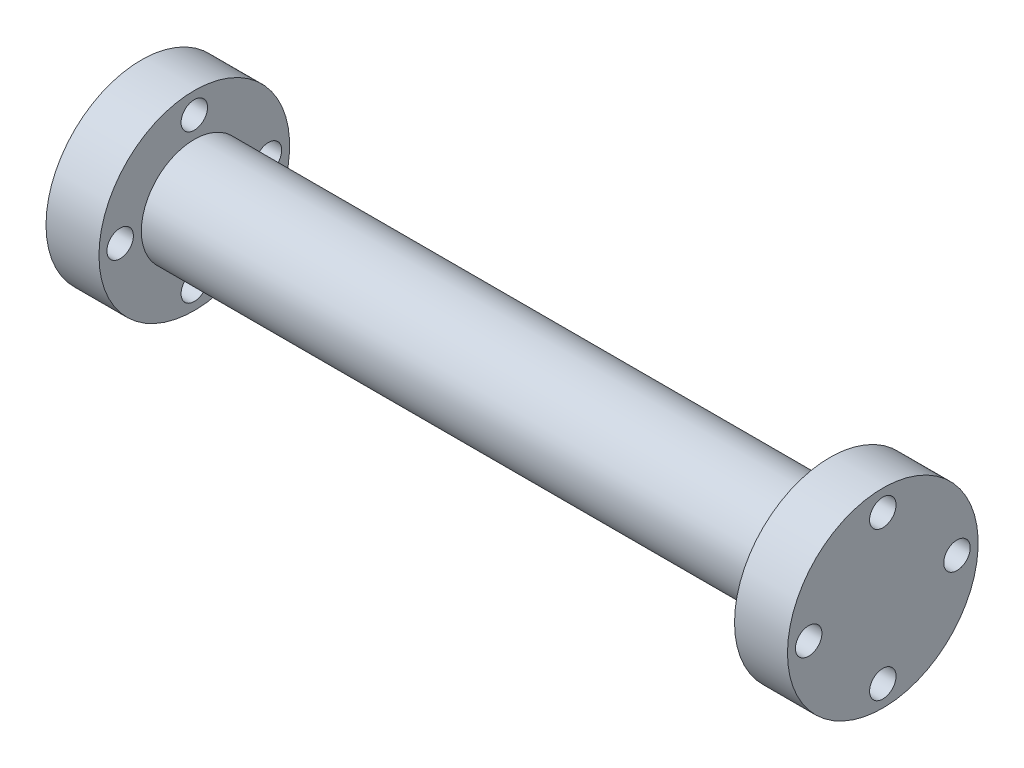
ISO-10303-21;
HEADER;
FILE_DESCRIPTION(('STEP AP214'),'2;1');
FILE_NAME('part.step','',(''),(''),'','','');
FILE_SCHEMA(('AUTOMOTIVE_DESIGN { 1 0 10303 214 1 1 1 1 }'));
ENDSEC;
DATA;
#1=APPLICATION_CONTEXT('core data for automotive mechanical design processes');
#2=APPLICATION_PROTOCOL_DEFINITION('international standard','automotive_design',2000,#1);
#3=PRODUCT_CONTEXT('',#1,'mechanical');
#4=PRODUCT('Part','Part','',(#3));
#5=PRODUCT_RELATED_PRODUCT_CATEGORY('part','',(#4));
#6=PRODUCT_DEFINITION_FORMATION('','',#4);
#7=PRODUCT_DEFINITION_CONTEXT('part definition',#1,'design');
#8=PRODUCT_DEFINITION('design','',#6,#7);
#9=PRODUCT_DEFINITION_SHAPE('','',#8);
#10=(LENGTH_UNIT() NAMED_UNIT(*) SI_UNIT(.MILLI.,.METRE.));
#11=(NAMED_UNIT(*) PLANE_ANGLE_UNIT() SI_UNIT($,.RADIAN.));
#12=(NAMED_UNIT(*) SI_UNIT($,.STERADIAN.) SOLID_ANGLE_UNIT());
#13=UNCERTAINTY_MEASURE_WITH_UNIT(LENGTH_MEASURE(1.E-05),#10,'distance_accuracy_value','');
#14=(GEOMETRIC_REPRESENTATION_CONTEXT(3) GLOBAL_UNCERTAINTY_ASSIGNED_CONTEXT((#13)) GLOBAL_UNIT_ASSIGNED_CONTEXT((#10,
#11,#12)) REPRESENTATION_CONTEXT('',''));
#15=CARTESIAN_POINT('',(0.,0.,0.));
#16=DIRECTION('',(0.,0.,1.));
#17=DIRECTION('',(1.,0.,0.));
#18=AXIS2_PLACEMENT_3D('',#15,#16,#17);
#19=CARTESIAN_POINT('',(-43.9050676278634,9.,0.));
#20=DIRECTION('',(1.,0.,0.));
#21=DIRECTION('',(0.,0.,-1.));
#22=AXIS2_PLACEMENT_3D('',#19,#20,#21);
#23=PLANE('',#22);
#24=CARTESIAN_POINT('',(-43.9050676278634,7.,0.));
#25=DIRECTION('',(-1.,0.,0.));
#26=DIRECTION('',(0.,0.,1.));
#27=AXIS2_PLACEMENT_3D('',#24,#25,#26);
#28=CIRCLE('',#27,1.24999999999999);
#29=CARTESIAN_POINT('',(-43.9050676278634,7.,1.24999999999999));
#30=VERTEX_POINT('',#29);
#31=EDGE_CURVE('E79',#30,#30,#28,.T.);
#32=ORIENTED_EDGE('',*,*,#31,.F.);
#33=EDGE_LOOP('',(#32));
#34=FACE_BOUND('',#33,.T.);
#35=CARTESIAN_POINT('',(-43.9050676278634,0.,-7.));
#36=DIRECTION('',(-1.,0.,0.));
#37=DIRECTION('',(0.,0.,1.));
#38=AXIS2_PLACEMENT_3D('',#35,#36,#37);
#39=CIRCLE('',#38,1.24999999999999);
#40=CARTESIAN_POINT('',(-43.9050676278634,0.,-5.75000000000001));
#41=VERTEX_POINT('',#40);
#42=EDGE_CURVE('E73',#41,#41,#39,.T.);
#43=ORIENTED_EDGE('',*,*,#42,.F.);
#44=EDGE_LOOP('',(#43));
#45=FACE_BOUND('',#44,.T.);
#46=CARTESIAN_POINT('',(-43.9050676278634,-7.,0.));
#47=DIRECTION('',(-1.,0.,0.));
#48=DIRECTION('',(0.,0.,1.));
#49=AXIS2_PLACEMENT_3D('',#46,#47,#48);
#50=CIRCLE('',#49,1.24999999999999);
#51=CARTESIAN_POINT('',(-43.9050676278634,-7.,1.24999999999999));
#52=VERTEX_POINT('',#51);
#53=EDGE_CURVE('E67',#52,#52,#50,.T.);
#54=ORIENTED_EDGE('',*,*,#53,.F.);
#55=EDGE_LOOP('',(#54));
#56=FACE_BOUND('',#55,.T.);
#57=CARTESIAN_POINT('',(-43.9050676278634,0.,0.));
#58=DIRECTION('',(-1.,0.,0.));
#59=DIRECTION('',(0.,0.,1.));
#60=AXIS2_PLACEMENT_3D('',#57,#58,#59);
#61=CIRCLE('',#60,9.);
#62=CARTESIAN_POINT('',(-43.9050676278634,0.,9.));
#63=VERTEX_POINT('',#62);
#64=EDGE_CURVE('E10',#63,#63,#61,.T.);
#65=ORIENTED_EDGE('',*,*,#64,.T.);
#66=EDGE_LOOP('',(#65));
#67=FACE_BOUND('',#66,.T.);
#68=CARTESIAN_POINT('',(-43.9050676278634,0.,7.));
#69=DIRECTION('',(-1.,0.,0.));
#70=DIRECTION('',(0.,0.,1.));
#71=AXIS2_PLACEMENT_3D('',#68,#69,#70);
#72=CIRCLE('',#71,1.24999999999999);
#73=CARTESIAN_POINT('',(-43.9050676278634,0.,8.24999999999999));
#74=VERTEX_POINT('',#73);
#75=EDGE_CURVE('E85',#74,#74,#72,.T.);
#76=ORIENTED_EDGE('',*,*,#75,.F.);
#77=EDGE_LOOP('',(#76));
#78=FACE_BOUND('',#77,.T.);
#79=ADVANCED_FACE('F38',(#34,#45,#56,#67,#78),#23,.F.);
#80=CARTESIAN_POINT('',(-43.9050676278634,0.,0.));
#81=DIRECTION('',(-1.,0.,0.));
#82=DIRECTION('',(0.,0.,1.));
#83=AXIS2_PLACEMENT_3D('',#80,#81,#82);
#84=CYLINDRICAL_SURFACE('',#83,9.);
#85=ORIENTED_EDGE('',*,*,#64,.F.);
#86=EDGE_LOOP('',(#85));
#87=FACE_BOUND('',#86,.T.);
#88=CARTESIAN_POINT('',(-38.9050676278634,0.,0.));
#89=DIRECTION('',(-1.,0.,0.));
#90=DIRECTION('',(0.,0.,1.));
#91=AXIS2_PLACEMENT_3D('',#88,#89,#90);
#92=CIRCLE('',#91,9.);
#93=CARTESIAN_POINT('',(-38.9050676278634,0.,9.));
#94=VERTEX_POINT('',#93);
#95=EDGE_CURVE('E61',#94,#94,#92,.T.);
#96=ORIENTED_EDGE('',*,*,#95,.T.);
#97=EDGE_LOOP('',(#96));
#98=FACE_BOUND('',#97,.T.);
#99=ADVANCED_FACE('F40',(#87,#98),#84,.T.);
#100=CARTESIAN_POINT('',(26.0949323721366,0.,0.));
#101=DIRECTION('',(-1.,0.,0.));
#102=DIRECTION('',(0.,0.,1.));
#103=AXIS2_PLACEMENT_3D('',#100,#101,#102);
#104=PLANE('',#103);
#105=CARTESIAN_POINT('',(26.0949323721366,-7.,0.));
#106=DIRECTION('',(1.,0.,0.));
#107=DIRECTION('',(0.,0.,-1.));
#108=AXIS2_PLACEMENT_3D('',#105,#106,#107);
#109=CIRCLE('',#108,1.24999999999999);
#110=CARTESIAN_POINT('',(26.0949323721366,-7.,-1.24999999999999));
#111=VERTEX_POINT('',#110);
#112=EDGE_CURVE('E109',#111,#111,#109,.T.);
#113=ORIENTED_EDGE('',*,*,#112,.F.);
#114=EDGE_LOOP('',(#113));
#115=FACE_BOUND('',#114,.T.);
#116=CARTESIAN_POINT('',(26.0949323721366,0.,-7.));
#117=DIRECTION('',(1.,0.,0.));
#118=DIRECTION('',(0.,0.,-1.));
#119=AXIS2_PLACEMENT_3D('',#116,#117,#118);
#120=CIRCLE('',#119,1.24999999999999);
#121=CARTESIAN_POINT('',(26.0949323721366,0.,-8.24999999999999));
#122=VERTEX_POINT('',#121);
#123=EDGE_CURVE('E103',#122,#122,#120,.T.);
#124=ORIENTED_EDGE('',*,*,#123,.F.);
#125=EDGE_LOOP('',(#124));
#126=FACE_BOUND('',#125,.T.);
#127=CARTESIAN_POINT('',(26.0949323721366,7.,0.));
#128=DIRECTION('',(1.,0.,0.));
#129=DIRECTION('',(0.,0.,-1.));
#130=AXIS2_PLACEMENT_3D('',#127,#128,#129);
#131=CIRCLE('',#130,1.24999999999999);
#132=CARTESIAN_POINT('',(26.0949323721366,7.,-1.24999999999999));
#133=VERTEX_POINT('',#132);
#134=EDGE_CURVE('E97',#133,#133,#131,.T.);
#135=ORIENTED_EDGE('',*,*,#134,.F.);
#136=EDGE_LOOP('',(#135));
#137=FACE_BOUND('',#136,.T.);
#138=CARTESIAN_POINT('',(26.0949323721366,0.,7.));
#139=DIRECTION('',(1.,0.,0.));
#140=DIRECTION('',(0.,0.,-1.));
#141=AXIS2_PLACEMENT_3D('',#138,#139,#140);
#142=CIRCLE('',#141,1.24999999999999);
#143=CARTESIAN_POINT('',(26.0949323721366,0.,5.75000000000001));
#144=VERTEX_POINT('',#143);
#145=EDGE_CURVE('E91',#144,#144,#142,.T.);
#146=ORIENTED_EDGE('',*,*,#145,.F.);
#147=EDGE_LOOP('',(#146));
#148=FACE_BOUND('',#147,.T.);
#149=CARTESIAN_POINT('',(26.0949323721366,0.,0.));
#150=DIRECTION('',(-1.,0.,0.));
#151=DIRECTION('',(0.,0.,1.));
#152=AXIS2_PLACEMENT_3D('',#149,#150,#151);
#153=CIRCLE('',#152,9.00000000000001);
#154=CARTESIAN_POINT('',(26.0949323721366,0.,9.00000000000001));
#155=VERTEX_POINT('',#154);
#156=EDGE_CURVE('E45',#155,#155,#153,.T.);
#157=ORIENTED_EDGE('',*,*,#156,.F.);
#158=EDGE_LOOP('',(#157));
#159=FACE_BOUND('',#158,.T.);
#160=ADVANCED_FACE('F115',(#115,#126,#137,#148,#159),#104,.F.);
#161=CARTESIAN_POINT('',(-43.9050676278634,0.,0.));
#162=DIRECTION('',(-1.,0.,0.));
#163=DIRECTION('',(0.,0.,1.));
#164=AXIS2_PLACEMENT_3D('',#161,#162,#163);
#165=CYLINDRICAL_SURFACE('',#164,9.00000000000001);
#166=CARTESIAN_POINT('',(21.0949323721366,0.,0.));
#167=DIRECTION('',(-1.,0.,0.));
#168=DIRECTION('',(0.,0.,1.));
#169=AXIS2_PLACEMENT_3D('',#166,#167,#168);
#170=CIRCLE('',#169,9.00000000000001);
#171=CARTESIAN_POINT('',(21.0949323721366,0.,9.00000000000001));
#172=VERTEX_POINT('',#171);
#173=EDGE_CURVE('E49',#172,#172,#170,.T.);
#174=ORIENTED_EDGE('',*,*,#173,.F.);
#175=EDGE_LOOP('',(#174));
#176=FACE_BOUND('',#175,.T.);
#177=ORIENTED_EDGE('',*,*,#156,.T.);
#178=EDGE_LOOP('',(#177));
#179=FACE_BOUND('',#178,.T.);
#180=ADVANCED_FACE('F118',(#176,#179),#165,.T.);
#181=CARTESIAN_POINT('',(21.0949323721366,9.00000000000001,0.));
#182=DIRECTION('',(1.,0.,0.));
#183=DIRECTION('',(0.,0.,-1.));
#184=AXIS2_PLACEMENT_3D('',#181,#182,#183);
#185=PLANE('',#184);
#186=CARTESIAN_POINT('',(21.0949323721366,-7.,0.));
#187=DIRECTION('',(1.,0.,0.));
#188=DIRECTION('',(0.,0.,-1.));
#189=AXIS2_PLACEMENT_3D('',#186,#187,#188);
#190=CIRCLE('',#189,1.25);
#191=CARTESIAN_POINT('',(21.0949323721366,-7.,-1.25));
#192=VERTEX_POINT('',#191);
#193=EDGE_CURVE('E106',#192,#192,#190,.T.);
#194=ORIENTED_EDGE('',*,*,#193,.T.);
#195=EDGE_LOOP('',(#194));
#196=FACE_BOUND('',#195,.T.);
#197=CARTESIAN_POINT('',(21.0949323721366,0.,-7.));
#198=DIRECTION('',(1.,0.,0.));
#199=DIRECTION('',(0.,0.,-1.));
#200=AXIS2_PLACEMENT_3D('',#197,#198,#199);
#201=CIRCLE('',#200,1.25);
#202=CARTESIAN_POINT('',(21.0949323721366,0.,-8.25));
#203=VERTEX_POINT('',#202);
#204=EDGE_CURVE('E100',#203,#203,#201,.T.);
#205=ORIENTED_EDGE('',*,*,#204,.T.);
#206=EDGE_LOOP('',(#205));
#207=FACE_BOUND('',#206,.T.);
#208=CARTESIAN_POINT('',(21.0949323721366,7.,0.));
#209=DIRECTION('',(1.,0.,0.));
#210=DIRECTION('',(0.,0.,-1.));
#211=AXIS2_PLACEMENT_3D('',#208,#209,#210);
#212=CIRCLE('',#211,1.25);
#213=CARTESIAN_POINT('',(21.0949323721366,7.,-1.25));
#214=VERTEX_POINT('',#213);
#215=EDGE_CURVE('E94',#214,#214,#212,.T.);
#216=ORIENTED_EDGE('',*,*,#215,.T.);
#217=EDGE_LOOP('',(#216));
#218=FACE_BOUND('',#217,.T.);
#219=CARTESIAN_POINT('',(21.0949323721366,0.,7.));
#220=DIRECTION('',(1.,0.,0.));
#221=DIRECTION('',(0.,0.,-1.));
#222=AXIS2_PLACEMENT_3D('',#219,#220,#221);
#223=CIRCLE('',#222,1.25);
#224=CARTESIAN_POINT('',(21.0949323721366,0.,5.75));
#225=VERTEX_POINT('',#224);
#226=EDGE_CURVE('E88',#225,#225,#223,.T.);
#227=ORIENTED_EDGE('',*,*,#226,.T.);
#228=EDGE_LOOP('',(#227));
#229=FACE_BOUND('',#228,.T.);
#230=CARTESIAN_POINT('',(21.0949323721366,0.,0.));
#231=DIRECTION('',(-1.,0.,0.));
#232=DIRECTION('',(0.,0.,1.));
#233=AXIS2_PLACEMENT_3D('',#230,#231,#232);
#234=CIRCLE('',#233,5.);
#235=CARTESIAN_POINT('',(21.0949323721366,0.,5.));
#236=VERTEX_POINT('',#235);
#237=EDGE_CURVE('E53',#236,#236,#234,.T.);
#238=ORIENTED_EDGE('',*,*,#237,.F.);
#239=EDGE_LOOP('',(#238));
#240=FACE_BOUND('',#239,.T.);
#241=ORIENTED_EDGE('',*,*,#173,.T.);
#242=EDGE_LOOP('',(#241));
#243=FACE_BOUND('',#242,.T.);
#244=ADVANCED_FACE('F155',(#196,#207,#218,#229,#240,#243),#185,.F.);
#245=CARTESIAN_POINT('',(-43.9050676278634,0.,0.));
#246=DIRECTION('',(-1.,0.,0.));
#247=DIRECTION('',(0.,0.,1.));
#248=AXIS2_PLACEMENT_3D('',#245,#246,#247);
#249=CYLINDRICAL_SURFACE('',#248,5.);
#250=CARTESIAN_POINT('',(-38.9050676278634,0.,0.));
#251=DIRECTION('',(-1.,0.,0.));
#252=DIRECTION('',(0.,0.,1.));
#253=AXIS2_PLACEMENT_3D('',#250,#251,#252);
#254=CIRCLE('',#253,5.);
#255=CARTESIAN_POINT('',(-38.9050676278634,0.,5.));
#256=VERTEX_POINT('',#255);
#257=EDGE_CURVE('E58',#256,#256,#254,.T.);
#258=ORIENTED_EDGE('',*,*,#257,.F.);
#259=EDGE_LOOP('',(#258));
#260=FACE_BOUND('',#259,.T.);
#261=ORIENTED_EDGE('',*,*,#237,.T.);
#262=EDGE_LOOP('',(#261));
#263=FACE_BOUND('',#262,.T.);
#264=ADVANCED_FACE('F159',(#260,#263),#249,.T.);
#265=CARTESIAN_POINT('',(-38.9050676278634,5.,0.));
#266=DIRECTION('',(-1.,0.,0.));
#267=DIRECTION('',(0.,0.,1.));
#268=AXIS2_PLACEMENT_3D('',#265,#266,#267);
#269=PLANE('',#268);
#270=CARTESIAN_POINT('',(-38.9050676278634,0.,7.));
#271=DIRECTION('',(-1.,0.,0.));
#272=DIRECTION('',(0.,0.,1.));
#273=AXIS2_PLACEMENT_3D('',#270,#271,#272);
#274=CIRCLE('',#273,1.25);
#275=CARTESIAN_POINT('',(-38.9050676278634,0.,8.25));
#276=VERTEX_POINT('',#275);
#277=EDGE_CURVE('E82',#276,#276,#274,.T.);
#278=ORIENTED_EDGE('',*,*,#277,.T.);
#279=EDGE_LOOP('',(#278));
#280=FACE_BOUND('',#279,.T.);
#281=CARTESIAN_POINT('',(-38.9050676278634,7.,0.));
#282=DIRECTION('',(-1.,0.,0.));
#283=DIRECTION('',(0.,0.,1.));
#284=AXIS2_PLACEMENT_3D('',#281,#282,#283);
#285=CIRCLE('',#284,1.25);
#286=CARTESIAN_POINT('',(-38.9050676278634,7.,1.25));
#287=VERTEX_POINT('',#286);
#288=EDGE_CURVE('E76',#287,#287,#285,.T.);
#289=ORIENTED_EDGE('',*,*,#288,.T.);
#290=EDGE_LOOP('',(#289));
#291=FACE_BOUND('',#290,.T.);
#292=CARTESIAN_POINT('',(-38.9050676278634,0.,-7.));
#293=DIRECTION('',(-1.,0.,0.));
#294=DIRECTION('',(0.,0.,1.));
#295=AXIS2_PLACEMENT_3D('',#292,#293,#294);
#296=CIRCLE('',#295,1.25);
#297=CARTESIAN_POINT('',(-38.9050676278634,0.,-5.75));
#298=VERTEX_POINT('',#297);
#299=EDGE_CURVE('E70',#298,#298,#296,.T.);
#300=ORIENTED_EDGE('',*,*,#299,.T.);
#301=EDGE_LOOP('',(#300));
#302=FACE_BOUND('',#301,.T.);
#303=CARTESIAN_POINT('',(-38.9050676278634,-7.,0.));
#304=DIRECTION('',(-1.,0.,0.));
#305=DIRECTION('',(0.,0.,1.));
#306=AXIS2_PLACEMENT_3D('',#303,#304,#305);
#307=CIRCLE('',#306,1.25);
#308=CARTESIAN_POINT('',(-38.9050676278634,-7.,1.25));
#309=VERTEX_POINT('',#308);
#310=EDGE_CURVE('E64',#309,#309,#307,.T.);
#311=ORIENTED_EDGE('',*,*,#310,.T.);
#312=EDGE_LOOP('',(#311));
#313=FACE_BOUND('',#312,.T.);
#314=ORIENTED_EDGE('',*,*,#95,.F.);
#315=EDGE_LOOP('',(#314));
#316=FACE_BOUND('',#315,.T.);
#317=ORIENTED_EDGE('',*,*,#257,.T.);
#318=EDGE_LOOP('',(#317));
#319=FACE_BOUND('',#318,.T.);
#320=ADVANCED_FACE('F163',(#280,#291,#302,#313,#316,#319),#269,.F.);
#321=CARTESIAN_POINT('',(-43.9050676278634,-7.,0.));
#322=DIRECTION('',(-1.,0.,0.));
#323=DIRECTION('',(0.,0.,1.));
#324=AXIS2_PLACEMENT_3D('',#321,#322,#323);
#325=CYLINDRICAL_SURFACE('',#324,1.24999999999999);
#326=ORIENTED_EDGE('',*,*,#310,.F.);
#327=EDGE_LOOP('',(#326));
#328=FACE_BOUND('',#327,.T.);
#329=ORIENTED_EDGE('',*,*,#53,.T.);
#330=EDGE_LOOP('',(#329));
#331=FACE_BOUND('',#330,.T.);
#332=ADVANCED_FACE('F167',(#328,#331),#325,.F.);
#333=CARTESIAN_POINT('',(-43.9050676278634,0.,-7.));
#334=DIRECTION('',(-1.,0.,0.));
#335=DIRECTION('',(0.,0.,1.));
#336=AXIS2_PLACEMENT_3D('',#333,#334,#335);
#337=CYLINDRICAL_SURFACE('',#336,1.24999999999999);
#338=ORIENTED_EDGE('',*,*,#299,.F.);
#339=EDGE_LOOP('',(#338));
#340=FACE_BOUND('',#339,.T.);
#341=ORIENTED_EDGE('',*,*,#42,.T.);
#342=EDGE_LOOP('',(#341));
#343=FACE_BOUND('',#342,.T.);
#344=ADVANCED_FACE('F171',(#340,#343),#337,.F.);
#345=CARTESIAN_POINT('',(-43.9050676278634,7.,0.));
#346=DIRECTION('',(-1.,0.,0.));
#347=DIRECTION('',(0.,0.,1.));
#348=AXIS2_PLACEMENT_3D('',#345,#346,#347);
#349=CYLINDRICAL_SURFACE('',#348,1.24999999999999);
#350=ORIENTED_EDGE('',*,*,#288,.F.);
#351=EDGE_LOOP('',(#350));
#352=FACE_BOUND('',#351,.T.);
#353=ORIENTED_EDGE('',*,*,#31,.T.);
#354=EDGE_LOOP('',(#353));
#355=FACE_BOUND('',#354,.T.);
#356=ADVANCED_FACE('F140',(#352,#355),#349,.F.);
#357=CARTESIAN_POINT('',(-43.9050676278634,0.,7.));
#358=DIRECTION('',(-1.,0.,0.));
#359=DIRECTION('',(0.,0.,1.));
#360=AXIS2_PLACEMENT_3D('',#357,#358,#359);
#361=CYLINDRICAL_SURFACE('',#360,1.24999999999999);
#362=ORIENTED_EDGE('',*,*,#277,.F.);
#363=EDGE_LOOP('',(#362));
#364=FACE_BOUND('',#363,.T.);
#365=ORIENTED_EDGE('',*,*,#75,.T.);
#366=EDGE_LOOP('',(#365));
#367=FACE_BOUND('',#366,.T.);
#368=ADVANCED_FACE('F130',(#364,#367),#361,.F.);
#369=CARTESIAN_POINT('',(26.0949323721366,0.,7.));
#370=DIRECTION('',(1.,0.,0.));
#371=DIRECTION('',(0.,0.,-1.));
#372=AXIS2_PLACEMENT_3D('',#369,#370,#371);
#373=CYLINDRICAL_SURFACE('',#372,1.24999999999999);
#374=ORIENTED_EDGE('',*,*,#226,.F.);
#375=EDGE_LOOP('',(#374));
#376=FACE_BOUND('',#375,.T.);
#377=ORIENTED_EDGE('',*,*,#145,.T.);
#378=EDGE_LOOP('',(#377));
#379=FACE_BOUND('',#378,.T.);
#380=ADVANCED_FACE('F127',(#376,#379),#373,.F.);
#381=CARTESIAN_POINT('',(26.0949323721366,7.,0.));
#382=DIRECTION('',(1.,0.,0.));
#383=DIRECTION('',(0.,0.,-1.));
#384=AXIS2_PLACEMENT_3D('',#381,#382,#383);
#385=CYLINDRICAL_SURFACE('',#384,1.24999999999999);
#386=ORIENTED_EDGE('',*,*,#215,.F.);
#387=EDGE_LOOP('',(#386));
#388=FACE_BOUND('',#387,.T.);
#389=ORIENTED_EDGE('',*,*,#134,.T.);
#390=EDGE_LOOP('',(#389));
#391=FACE_BOUND('',#390,.T.);
#392=ADVANCED_FACE('F129',(#388,#391),#385,.F.);
#393=CARTESIAN_POINT('',(26.0949323721366,0.,-7.));
#394=DIRECTION('',(1.,0.,0.));
#395=DIRECTION('',(0.,0.,-1.));
#396=AXIS2_PLACEMENT_3D('',#393,#394,#395);
#397=CYLINDRICAL_SURFACE('',#396,1.24999999999999);
#398=ORIENTED_EDGE('',*,*,#204,.F.);
#399=EDGE_LOOP('',(#398));
#400=FACE_BOUND('',#399,.T.);
#401=ORIENTED_EDGE('',*,*,#123,.T.);
#402=EDGE_LOOP('',(#401));
#403=FACE_BOUND('',#402,.T.);
#404=ADVANCED_FACE('F137',(#400,#403),#397,.F.);
#405=CARTESIAN_POINT('',(26.0949323721366,-7.,0.));
#406=DIRECTION('',(1.,0.,0.));
#407=DIRECTION('',(0.,0.,-1.));
#408=AXIS2_PLACEMENT_3D('',#405,#406,#407);
#409=CYLINDRICAL_SURFACE('',#408,1.24999999999999);
#410=ORIENTED_EDGE('',*,*,#193,.F.);
#411=EDGE_LOOP('',(#410));
#412=FACE_BOUND('',#411,.T.);
#413=ORIENTED_EDGE('',*,*,#112,.T.);
#414=EDGE_LOOP('',(#413));
#415=FACE_BOUND('',#414,.T.);
#416=ADVANCED_FACE('F113',(#412,#415),#409,.F.);
#417=CLOSED_SHELL('',(#79,#99,#160,#180,#244,#264,#320,#332,#344,#356,#368,#380,#392,#404,#416));
#418=MANIFOLD_SOLID_BREP('B2',#417);
#419=ADVANCED_BREP_SHAPE_REPRESENTATION('',(#18,#418),#14);
#420=SHAPE_DEFINITION_REPRESENTATION(#9,#419);
ENDSEC;
END-ISO-10303-21;
